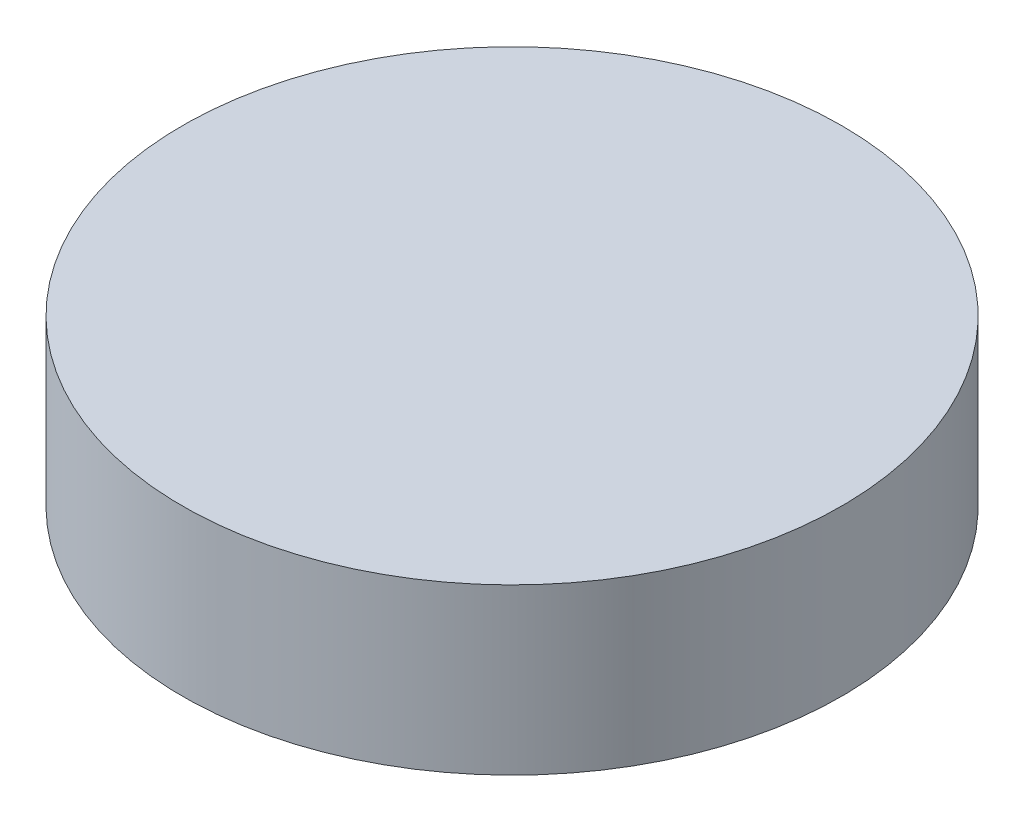
ISO-10303-21;
HEADER;
FILE_DESCRIPTION(('STEP AP214'),'2;1');
FILE_NAME('part.step','',(''),(''),'','','');
FILE_SCHEMA(('AUTOMOTIVE_DESIGN { 1 0 10303 214 1 1 1 1 }'));
ENDSEC;
DATA;
#1=APPLICATION_CONTEXT('core data for automotive mechanical design processes');
#2=APPLICATION_PROTOCOL_DEFINITION('international standard','automotive_design',2000,#1);
#3=PRODUCT_CONTEXT('',#1,'mechanical');
#4=PRODUCT('Part','Part','',(#3));
#5=PRODUCT_RELATED_PRODUCT_CATEGORY('part','',(#4));
#6=PRODUCT_DEFINITION_FORMATION('','',#4);
#7=PRODUCT_DEFINITION_CONTEXT('part definition',#1,'design');
#8=PRODUCT_DEFINITION('design','',#6,#7);
#9=PRODUCT_DEFINITION_SHAPE('','',#8);
#10=(LENGTH_UNIT() NAMED_UNIT(*) SI_UNIT(.MILLI.,.METRE.));
#11=(NAMED_UNIT(*) PLANE_ANGLE_UNIT() SI_UNIT($,.RADIAN.));
#12=(NAMED_UNIT(*) SI_UNIT($,.STERADIAN.) SOLID_ANGLE_UNIT());
#13=UNCERTAINTY_MEASURE_WITH_UNIT(LENGTH_MEASURE(1.E-05),#10,'distance_accuracy_value','');
#14=(GEOMETRIC_REPRESENTATION_CONTEXT(3) GLOBAL_UNCERTAINTY_ASSIGNED_CONTEXT((#13)) GLOBAL_UNIT_ASSIGNED_CONTEXT((#10,
#11,#12)) REPRESENTATION_CONTEXT('',''));
#15=CARTESIAN_POINT('',(0.,0.,0.));
#16=DIRECTION('',(0.,0.,1.));
#17=DIRECTION('',(1.,0.,0.));
#18=AXIS2_PLACEMENT_3D('',#15,#16,#17);
#19=CARTESIAN_POINT('',(0.,0.,0.));
#20=DIRECTION('',(0.,-1.,0.));
#21=DIRECTION('',(0.,0.,-1.));
#22=AXIS2_PLACEMENT_3D('',#19,#20,#21);
#23=PLANE('',#22);
#24=CARTESIAN_POINT('',(0.,0.,0.));
#25=DIRECTION('',(0.,-1.,0.));
#26=DIRECTION('',(0.,0.,-1.));
#27=AXIS2_PLACEMENT_3D('',#24,#25,#26);
#28=CIRCLE('',#27,16.);
#29=CARTESIAN_POINT('',(0.,0.,-16.));
#30=VERTEX_POINT('',#29);
#31=EDGE_CURVE('E10',#30,#30,#28,.T.);
#32=ORIENTED_EDGE('',*,*,#31,.T.);
#33=EDGE_LOOP('',(#32));
#34=FACE_BOUND('',#33,.T.);
#35=ADVANCED_FACE('F37',(#34),#23,.T.);
#36=CARTESIAN_POINT('',(0.,0.,0.));
#37=DIRECTION('',(0.,-1.,0.));
#38=DIRECTION('',(0.,0.,-1.));
#39=AXIS2_PLACEMENT_3D('',#36,#37,#38);
#40=CYLINDRICAL_SURFACE('',#39,16.);
#41=CARTESIAN_POINT('',(0.,8.,0.));
#42=DIRECTION('',(0.,-1.,0.));
#43=DIRECTION('',(0.,0.,-1.));
#44=AXIS2_PLACEMENT_3D('',#41,#42,#43);
#45=CIRCLE('',#44,16.);
#46=CARTESIAN_POINT('',(0.,8.,-16.));
#47=VERTEX_POINT('',#46);
#48=EDGE_CURVE('E43',#47,#47,#45,.T.);
#49=ORIENTED_EDGE('',*,*,#48,.T.);
#50=EDGE_LOOP('',(#49));
#51=FACE_BOUND('',#50,.T.);
#52=ORIENTED_EDGE('',*,*,#31,.F.);
#53=EDGE_LOOP('',(#52));
#54=FACE_BOUND('',#53,.T.);
#55=ADVANCED_FACE('F49',(#51,#54),#40,.T.);
#56=CARTESIAN_POINT('',(16.,8.,0.));
#57=DIRECTION('',(0.,1.,0.));
#58=DIRECTION('',(0.,0.,1.));
#59=AXIS2_PLACEMENT_3D('',#56,#57,#58);
#60=PLANE('',#59);
#61=ORIENTED_EDGE('',*,*,#48,.F.);
#62=EDGE_LOOP('',(#61));
#63=FACE_BOUND('',#62,.T.);
#64=ADVANCED_FACE('F52',(#63),#60,.T.);
#65=CLOSED_SHELL('',(#35,#55,#64));
#66=MANIFOLD_SOLID_BREP('B2',#65);
#67=ADVANCED_BREP_SHAPE_REPRESENTATION('',(#18,#66),#14);
#68=SHAPE_DEFINITION_REPRESENTATION(#9,#67);
ENDSEC;
END-ISO-10303-21;
